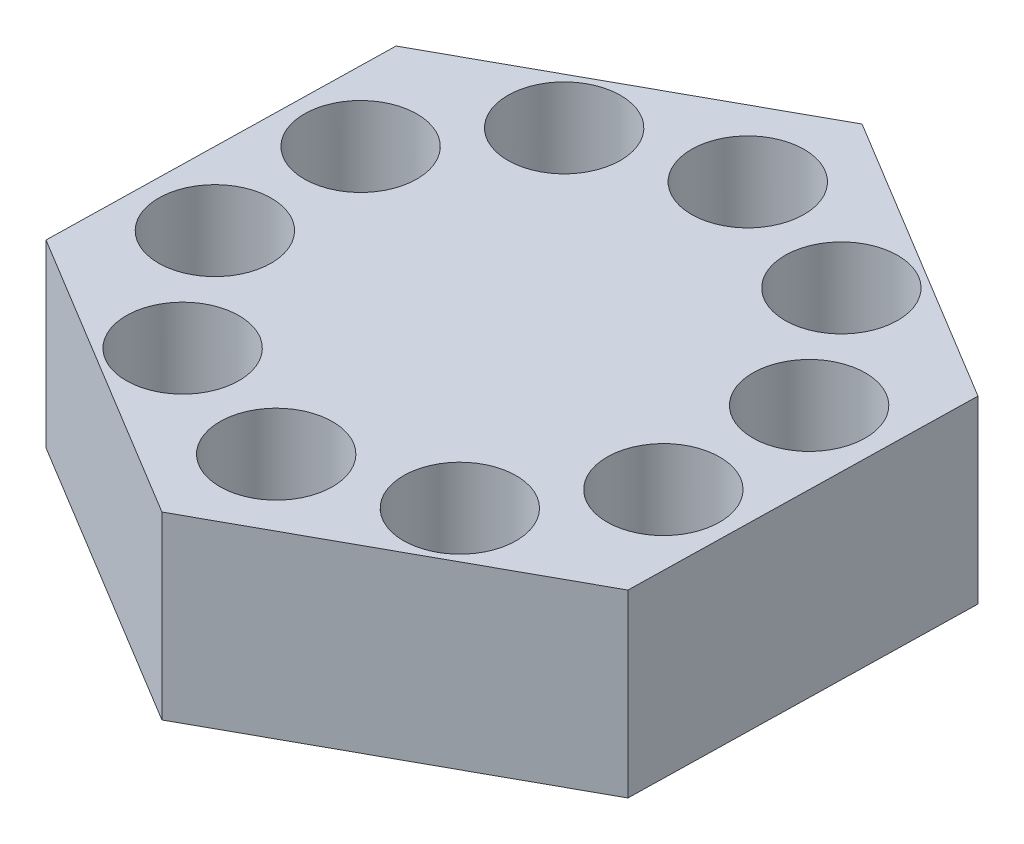
ISO-10303-21;
HEADER;
FILE_DESCRIPTION(('STEP AP214'),'2;1');
FILE_NAME('part.step','',(''),(''),'','','');
FILE_SCHEMA(('AUTOMOTIVE_DESIGN { 1 0 10303 214 1 1 1 1 }'));
ENDSEC;
DATA;
#1=APPLICATION_CONTEXT('core data for automotive mechanical design processes');
#2=APPLICATION_PROTOCOL_DEFINITION('international standard','automotive_design',2000,#1);
#3=PRODUCT_CONTEXT('',#1,'mechanical');
#4=PRODUCT('Part','Part','',(#3));
#5=PRODUCT_RELATED_PRODUCT_CATEGORY('part','',(#4));
#6=PRODUCT_DEFINITION_FORMATION('','',#4);
#7=PRODUCT_DEFINITION_CONTEXT('part definition',#1,'design');
#8=PRODUCT_DEFINITION('design','',#6,#7);
#9=PRODUCT_DEFINITION_SHAPE('','',#8);
#10=(LENGTH_UNIT() NAMED_UNIT(*) SI_UNIT(.MILLI.,.METRE.));
#11=(NAMED_UNIT(*) PLANE_ANGLE_UNIT() SI_UNIT($,.RADIAN.));
#12=(NAMED_UNIT(*) SI_UNIT($,.STERADIAN.) SOLID_ANGLE_UNIT());
#13=UNCERTAINTY_MEASURE_WITH_UNIT(LENGTH_MEASURE(1.E-05),#10,'distance_accuracy_value','');
#14=(GEOMETRIC_REPRESENTATION_CONTEXT(3) GLOBAL_UNCERTAINTY_ASSIGNED_CONTEXT((#13)) GLOBAL_UNIT_ASSIGNED_CONTEXT((#10,
#11,#12)) REPRESENTATION_CONTEXT('',''));
#15=CARTESIAN_POINT('',(0.,0.,0.));
#16=DIRECTION('',(0.,0.,1.));
#17=DIRECTION('',(1.,0.,0.));
#18=AXIS2_PLACEMENT_3D('',#15,#16,#17);
#19=CARTESIAN_POINT('',(-1.41267243604774,27.178,68.7033259763577));
#20=DIRECTION('',(-0.48209095163602,0.,-0.876121175609103));
#21=DIRECTION('',(-0.876121175609103,0.,0.48209095163602));
#22=AXIS2_PLACEMENT_3D('',#19,#20,#21);
#23=PLANE('',#22);
#24=DIRECTION('',(0.,-1.,0.));
#25=VECTOR('',#24,1.);
#26=CARTESIAN_POINT('',(-1.41267243604774,27.178,68.7033259763577));
#27=LINE('',#26,#25);
#28=CARTESIAN_POINT('',(-1.41267243604774,27.178,68.7033259763577));
#29=VERTEX_POINT('',#28);
#30=CARTESIAN_POINT('',(-1.41267243604774,-8.89,68.7033259763577));
#31=VERTEX_POINT('',#30);
#32=EDGE_CURVE('E103',#29,#31,#27,.T.);
#33=ORIENTED_EDGE('',*,*,#32,.T.);
#34=DIRECTION('',(0.876121175609103,0.,-0.48209095163602));
#35=VECTOR('',#34,1.);
#36=CARTESIAN_POINT('',(-1.41267243604774,-8.89,68.7033259763577));
#37=LINE('',#36,#35);
#38=CARTESIAN_POINT('',(58.7924894019852,-8.89,35.5750732050222));
#39=VERTEX_POINT('',#38);
#40=EDGE_CURVE('E97',#31,#39,#37,.T.);
#41=ORIENTED_EDGE('',*,*,#40,.T.);
#42=DIRECTION('',(0.,-1.,0.));
#43=VECTOR('',#42,1.);
#44=CARTESIAN_POINT('',(58.7924894019852,27.178,35.5750732050222));
#45=LINE('',#44,#43);
#46=CARTESIAN_POINT('',(58.7924894019852,27.178,35.5750732050222));
#47=VERTEX_POINT('',#46);
#48=EDGE_CURVE('E11',#47,#39,#45,.T.);
#49=ORIENTED_EDGE('',*,*,#48,.F.);
#50=DIRECTION('',(0.876121175609103,0.,-0.48209095163602));
#51=VECTOR('',#50,1.);
#52=CARTESIAN_POINT('',(-1.41267243604774,27.178,68.7033259763577));
#53=LINE('',#52,#51);
#54=EDGE_CURVE('E120',#29,#47,#53,.T.);
#55=ORIENTED_EDGE('',*,*,#54,.F.);
#56=EDGE_LOOP('',(#33,#41,#49,#55));
#57=FACE_BOUND('',#56,.T.);
#58=ADVANCED_FACE('F33',(#57),#23,.F.);
#59=CARTESIAN_POINT('',(58.7924894019852,27.178,35.5750732050222));
#60=DIRECTION('',(-0.99978867068898,0.,-0.0205575767531424));
#61=DIRECTION('',(-0.0205575767531424,0.,0.99978867068898));
#62=AXIS2_PLACEMENT_3D('',#59,#60,#61);
#63=PLANE('',#62);
#64=ORIENTED_EDGE('',*,*,#48,.T.);
#65=DIRECTION('',(0.0205575767531424,0.,-0.999788670688981));
#66=VECTOR('',#65,1.);
#67=CARTESIAN_POINT('',(58.7924894019852,-8.89,35.5750732050222));
#68=LINE('',#67,#66);
#69=CARTESIAN_POINT('',(60.2051618380329,-8.89,-33.1282527713354));
#70=VERTEX_POINT('',#69);
#71=EDGE_CURVE('E87',#39,#70,#68,.T.);
#72=ORIENTED_EDGE('',*,*,#71,.T.);
#73=DIRECTION('',(0.,-1.,0.));
#74=VECTOR('',#73,1.);
#75=CARTESIAN_POINT('',(60.2051618380329,27.178,-33.1282527713354));
#76=LINE('',#75,#74);
#77=CARTESIAN_POINT('',(60.2051618380329,27.178,-33.1282527713354));
#78=VERTEX_POINT('',#77);
#79=EDGE_CURVE('E40',#78,#70,#76,.T.);
#80=ORIENTED_EDGE('',*,*,#79,.F.);
#81=DIRECTION('',(0.0205575767531424,0.,-0.999788670688981));
#82=VECTOR('',#81,1.);
#83=CARTESIAN_POINT('',(58.7924894019852,27.178,35.5750732050222));
#84=LINE('',#83,#82);
#85=EDGE_CURVE('E88',#47,#78,#84,.T.);
#86=ORIENTED_EDGE('',*,*,#85,.F.);
#87=EDGE_LOOP('',(#64,#72,#80,#86));
#88=FACE_BOUND('',#87,.T.);
#89=ADVANCED_FACE('F85',(#88),#63,.F.);
#90=CARTESIAN_POINT('',(60.2051618380329,27.178,-33.1282527713354));
#91=DIRECTION('',(-0.51769771905296,0.,0.85556359885596));
#92=DIRECTION('',(0.85556359885596,0.,0.51769771905296));
#93=AXIS2_PLACEMENT_3D('',#90,#91,#92);
#94=PLANE('',#93);
#95=ORIENTED_EDGE('',*,*,#79,.T.);
#96=DIRECTION('',(-0.85556359885596,0.,-0.51769771905296));
#97=VECTOR('',#96,1.);
#98=CARTESIAN_POINT('',(60.2051618380329,-8.89,-33.1282527713354));
#99=LINE('',#98,#97);
#100=CARTESIAN_POINT('',(1.41267243604774,-8.89,-68.7033259763577));
#101=VERTEX_POINT('',#100);
#102=EDGE_CURVE('E101',#70,#101,#99,.T.);
#103=ORIENTED_EDGE('',*,*,#102,.T.);
#104=DIRECTION('',(0.,-1.,0.));
#105=VECTOR('',#104,1.);
#106=CARTESIAN_POINT('',(1.41267243604774,27.178,-68.7033259763577));
#107=LINE('',#106,#105);
#108=CARTESIAN_POINT('',(1.41267243604774,27.178,-68.7033259763577));
#109=VERTEX_POINT('',#108);
#110=EDGE_CURVE('E134',#109,#101,#107,.T.);
#111=ORIENTED_EDGE('',*,*,#110,.F.);
#112=DIRECTION('',(-0.85556359885596,0.,-0.51769771905296));
#113=VECTOR('',#112,1.);
#114=CARTESIAN_POINT('',(60.2051618380329,27.178,-33.1282527713354));
#115=LINE('',#114,#113);
#116=EDGE_CURVE('E123',#78,#109,#115,.T.);
#117=ORIENTED_EDGE('',*,*,#116,.F.);
#118=EDGE_LOOP('',(#95,#103,#111,#117));
#119=FACE_BOUND('',#118,.T.);
#120=ADVANCED_FACE('F137',(#119),#94,.F.);
#121=CARTESIAN_POINT('',(1.41267243604774,27.178,-68.7033259763577));
#122=DIRECTION('',(0.48209095163602,0.,0.876121175609103));
#123=DIRECTION('',(0.876121175609103,0.,-0.48209095163602));
#124=AXIS2_PLACEMENT_3D('',#121,#122,#123);
#125=PLANE('',#124);
#126=ORIENTED_EDGE('',*,*,#110,.T.);
#127=DIRECTION('',(-0.876121175609103,0.,0.48209095163602));
#128=VECTOR('',#127,1.);
#129=CARTESIAN_POINT('',(1.41267243604774,-8.89,-68.7033259763577));
#130=LINE('',#129,#128);
#131=CARTESIAN_POINT('',(-58.7924894019852,-8.89,-35.5750732050223));
#132=VERTEX_POINT('',#131);
#133=EDGE_CURVE('E112',#101,#132,#130,.T.);
#134=ORIENTED_EDGE('',*,*,#133,.T.);
#135=DIRECTION('',(0.,-1.,0.));
#136=VECTOR('',#135,1.);
#137=CARTESIAN_POINT('',(-58.7924894019852,27.178,-35.5750732050223));
#138=LINE('',#137,#136);
#139=CARTESIAN_POINT('',(-58.7924894019852,27.178,-35.5750732050223));
#140=VERTEX_POINT('',#139);
#141=EDGE_CURVE('E132',#140,#132,#138,.T.);
#142=ORIENTED_EDGE('',*,*,#141,.F.);
#143=DIRECTION('',(-0.876121175609103,0.,0.48209095163602));
#144=VECTOR('',#143,1.);
#145=CARTESIAN_POINT('',(1.41267243604774,27.178,-68.7033259763577));
#146=LINE('',#145,#144);
#147=EDGE_CURVE('E125',#109,#140,#146,.T.);
#148=ORIENTED_EDGE('',*,*,#147,.F.);
#149=EDGE_LOOP('',(#126,#134,#142,#148));
#150=FACE_BOUND('',#149,.T.);
#151=ADVANCED_FACE('F143',(#150),#125,.F.);
#152=CARTESIAN_POINT('',(-58.7924894019852,27.178,-35.5750732050223));
#153=DIRECTION('',(0.999788670688981,0.,0.0205575767531425));
#154=DIRECTION('',(0.0205575767531425,0.,-0.999788670688981));
#155=AXIS2_PLACEMENT_3D('',#152,#153,#154);
#156=PLANE('',#155);
#157=ORIENTED_EDGE('',*,*,#141,.T.);
#158=DIRECTION('',(-0.0205575767531425,0.,0.99978867068898));
#159=VECTOR('',#158,1.);
#160=CARTESIAN_POINT('',(-58.7924894019852,-8.89,-35.5750732050223));
#161=LINE('',#160,#159);
#162=CARTESIAN_POINT('',(-60.2051618380329,-8.89,33.1282527713354));
#163=VERTEX_POINT('',#162);
#164=EDGE_CURVE('E115',#132,#163,#161,.T.);
#165=ORIENTED_EDGE('',*,*,#164,.T.);
#166=DIRECTION('',(0.,-1.,0.));
#167=VECTOR('',#166,1.);
#168=CARTESIAN_POINT('',(-60.2051618380329,27.178,33.1282527713354));
#169=LINE('',#168,#167);
#170=CARTESIAN_POINT('',(-60.2051618380329,27.178,33.1282527713354));
#171=VERTEX_POINT('',#170);
#172=EDGE_CURVE('E130',#171,#163,#169,.T.);
#173=ORIENTED_EDGE('',*,*,#172,.F.);
#174=DIRECTION('',(-0.0205575767531425,0.,0.99978867068898));
#175=VECTOR('',#174,1.);
#176=CARTESIAN_POINT('',(-58.7924894019852,27.178,-35.5750732050223));
#177=LINE('',#176,#175);
#178=EDGE_CURVE('E52',#140,#171,#177,.T.);
#179=ORIENTED_EDGE('',*,*,#178,.F.);
#180=EDGE_LOOP('',(#157,#165,#173,#179));
#181=FACE_BOUND('',#180,.T.);
#182=ADVANCED_FACE('F146',(#181),#156,.F.);
#183=CARTESIAN_POINT('',(-60.2051618380329,27.178,33.1282527713354));
#184=DIRECTION('',(0.51769771905296,0.,-0.85556359885596));
#185=DIRECTION('',(-0.85556359885596,0.,-0.51769771905296));
#186=AXIS2_PLACEMENT_3D('',#183,#184,#185);
#187=PLANE('',#186);
#188=ORIENTED_EDGE('',*,*,#172,.T.);
#189=DIRECTION('',(0.85556359885596,0.,0.51769771905296));
#190=VECTOR('',#189,1.);
#191=CARTESIAN_POINT('',(-60.2051618380329,-8.89,33.1282527713354));
#192=LINE('',#191,#190);
#193=EDGE_CURVE('E118',#163,#31,#192,.T.);
#194=ORIENTED_EDGE('',*,*,#193,.T.);
#195=ORIENTED_EDGE('',*,*,#32,.F.);
#196=DIRECTION('',(0.85556359885596,0.,0.51769771905296));
#197=VECTOR('',#196,1.);
#198=CARTESIAN_POINT('',(-60.2051618380329,27.178,33.1282527713354));
#199=LINE('',#198,#197);
#200=EDGE_CURVE('E47',#171,#29,#199,.T.);
#201=ORIENTED_EDGE('',*,*,#200,.F.);
#202=EDGE_LOOP('',(#188,#194,#195,#201));
#203=FACE_BOUND('',#202,.T.);
#204=ADVANCED_FACE('F148',(#203),#187,.F.);
#205=CARTESIAN_POINT('',(0.,27.178,0.));
#206=DIRECTION('',(0.,1.,0.));
#207=DIRECTION('',(0.,0.,1.));
#208=AXIS2_PLACEMENT_3D('',#205,#206,#207);
#209=PLANE('',#208);
#210=CARTESIAN_POINT('',(27.7587286513236,27.178,38.206612250948));
#211=DIRECTION('',(0.,1.,0.));
#212=DIRECTION('',(0.587785252292462,0.,0.809016994374955));
#213=AXIS2_PLACEMENT_3D('',#210,#211,#212);
#214=CIRCLE('',#213,11.2894808694161);
#215=CARTESIAN_POINT('',(34.3945190124043,27.178,47.3399941319766));
#216=VERTEX_POINT('',#215);
#217=EDGE_CURVE('E302',#216,#216,#214,.T.);
#218=ORIENTED_EDGE('',*,*,#217,.F.);
#219=EDGE_LOOP('',(#218));
#220=FACE_BOUND('',#219,.T.);
#221=CARTESIAN_POINT('',(44.9145664423277,27.178,14.5936272848744));
#222=DIRECTION('',(0.,1.,0.));
#223=DIRECTION('',(0.95105651629515,0.,0.309016994374958));
#224=AXIS2_PLACEMENT_3D('',#221,#222,#223);
#225=CIRCLE('',#224,11.2894808694161);
#226=CARTESIAN_POINT('',(55.6515007887754,27.178,18.0822687311949));
#227=VERTEX_POINT('',#226);
#228=EDGE_CURVE('E306',#227,#227,#225,.T.);
#229=ORIENTED_EDGE('',*,*,#228,.F.);
#230=EDGE_LOOP('',(#229));
#231=FACE_BOUND('',#230,.T.);
#232=CARTESIAN_POINT('',(44.914566442328,27.178,-14.5936272848734));
#233=DIRECTION('',(0.,1.,0.));
#234=DIRECTION('',(0.951056516295157,0.,-0.309016994374938));
#235=AXIS2_PLACEMENT_3D('',#232,#233,#234);
#236=CIRCLE('',#235,11.2894808694161);
#237=CARTESIAN_POINT('',(55.6515007887757,27.178,-18.0822687311938));
#238=VERTEX_POINT('',#237);
#239=EDGE_CURVE('E363',#238,#238,#236,.T.);
#240=ORIENTED_EDGE('',*,*,#239,.F.);
#241=EDGE_LOOP('',(#240));
#242=FACE_BOUND('',#241,.T.);
#243=CARTESIAN_POINT('',(27.7587286513244,27.178,-38.2066122509474));
#244=DIRECTION('',(0.,1.,0.));
#245=DIRECTION('',(0.58778525229248,0.,-0.809016994374942));
#246=AXIS2_PLACEMENT_3D('',#243,#244,#245);
#247=CIRCLE('',#246,11.2894808694161);
#248=CARTESIAN_POINT('',(34.3945190124053,27.178,-47.3399941319758));
#249=VERTEX_POINT('',#248);
#250=EDGE_CURVE('E357',#249,#249,#247,.T.);
#251=ORIENTED_EDGE('',*,*,#250,.F.);
#252=EDGE_LOOP('',(#251));
#253=FACE_BOUND('',#252,.T.);
#254=CARTESIAN_POINT('',(0.,27.178,-47.2259699321475));
#255=DIRECTION('',(0.,1.,0.));
#256=DIRECTION('',(0.,0.,-1.));
#257=AXIS2_PLACEMENT_3D('',#254,#255,#256);
#258=CIRCLE('',#257,11.2894808694161);
#259=CARTESIAN_POINT('',(0.,27.178,-58.5154508015636));
#260=VERTEX_POINT('',#259);
#261=EDGE_CURVE('E351',#260,#260,#258,.T.);
#262=ORIENTED_EDGE('',*,*,#261,.F.);
#263=EDGE_LOOP('',(#262));
#264=FACE_BOUND('',#263,.T.);
#265=CARTESIAN_POINT('',(-27.7587286513238,27.178,-38.2066122509478));
#266=DIRECTION('',(0.,1.,0.));
#267=DIRECTION('',(-0.587785252292469,0.,-0.809016994374951));
#268=AXIS2_PLACEMENT_3D('',#265,#266,#267);
#269=CIRCLE('',#268,11.2894808694161);
#270=CARTESIAN_POINT('',(-34.3945190124046,27.178,-47.3399941319763));
#271=VERTEX_POINT('',#270);
#272=EDGE_CURVE('E345',#271,#271,#269,.T.);
#273=ORIENTED_EDGE('',*,*,#272,.F.);
#274=EDGE_LOOP('',(#273));
#275=FACE_BOUND('',#274,.T.);
#276=CARTESIAN_POINT('',(-44.9145664423278,27.178,-14.5936272848741));
#277=DIRECTION('',(0.,1.,0.));
#278=DIRECTION('',(-0.951056516295152,0.,-0.309016994374952));
#279=AXIS2_PLACEMENT_3D('',#276,#277,#278);
#280=CIRCLE('',#279,11.2894808694161);
#281=CARTESIAN_POINT('',(-55.6515007887755,27.178,-18.0822687311945));
#282=VERTEX_POINT('',#281);
#283=EDGE_CURVE('E339',#282,#282,#280,.T.);
#284=ORIENTED_EDGE('',*,*,#283,.F.);
#285=EDGE_LOOP('',(#284));
#286=FACE_BOUND('',#285,.T.);
#287=CARTESIAN_POINT('',(-44.9145664423279,27.178,14.5936272848737));
#288=DIRECTION('',(0.,1.,0.));
#289=DIRECTION('',(-0.951056516295155,0.,0.309016994374945));
#290=AXIS2_PLACEMENT_3D('',#287,#288,#289);
#291=CIRCLE('',#290,11.2894808694161);
#292=CARTESIAN_POINT('',(-55.6515007887756,27.178,18.0822687311941));
#293=VERTEX_POINT('',#292);
#294=EDGE_CURVE('E331',#293,#293,#291,.T.);
#295=ORIENTED_EDGE('',*,*,#294,.F.);
#296=EDGE_LOOP('',(#295));
#297=FACE_BOUND('',#296,.T.);
#298=CARTESIAN_POINT('',(-27.7587286513241,27.178,38.2066122509476));
#299=DIRECTION('',(0.,1.,0.));
#300=DIRECTION('',(-0.587785252292474,0.,0.809016994374947));
#301=AXIS2_PLACEMENT_3D('',#298,#299,#300);
#302=CIRCLE('',#301,11.2894808694161);
#303=CARTESIAN_POINT('',(-34.3945190124049,27.178,47.3399941319761));
#304=VERTEX_POINT('',#303);
#305=EDGE_CURVE('E314',#304,#304,#302,.T.);
#306=ORIENTED_EDGE('',*,*,#305,.F.);
#307=EDGE_LOOP('',(#306));
#308=FACE_BOUND('',#307,.T.);
#309=CARTESIAN_POINT('',(0.,27.178,47.2259699321475));
#310=DIRECTION('',(0.,1.,0.));
#311=DIRECTION('',(0.,0.,1.));
#312=AXIS2_PLACEMENT_3D('',#309,#310,#311);
#313=CIRCLE('',#312,11.2894808694161);
#314=CARTESIAN_POINT('',(0.,27.178,58.5154508015636));
#315=VERTEX_POINT('',#314);
#316=EDGE_CURVE('E107',#315,#315,#313,.T.);
#317=ORIENTED_EDGE('',*,*,#316,.F.);
#318=EDGE_LOOP('',(#317));
#319=FACE_BOUND('',#318,.T.);
#320=ORIENTED_EDGE('',*,*,#54,.T.);
#321=ORIENTED_EDGE('',*,*,#85,.T.);
#322=ORIENTED_EDGE('',*,*,#116,.T.);
#323=ORIENTED_EDGE('',*,*,#147,.T.);
#324=ORIENTED_EDGE('',*,*,#178,.T.);
#325=ORIENTED_EDGE('',*,*,#200,.T.);
#326=EDGE_LOOP('',(#320,#321,#322,#323,#324,#325));
#327=FACE_BOUND('',#326,.T.);
#328=ADVANCED_FACE('F140',(#220,#231,#242,#253,#264,#275,#286,#297,#308,#319,#327),#209,.T.);
#329=CARTESIAN_POINT('',(0.,-8.89,0.));
#330=DIRECTION('',(0.,1.,0.));
#331=DIRECTION('',(0.,0.,1.));
#332=AXIS2_PLACEMENT_3D('',#329,#330,#331);
#333=PLANE('',#332);
#334=CARTESIAN_POINT('',(27.7587286513236,-8.89,38.206612250948));
#335=DIRECTION('',(0.,1.,0.));
#336=DIRECTION('',(0.,0.,1.));
#337=AXIS2_PLACEMENT_3D('',#334,#335,#336);
#338=CIRCLE('',#337,11.2894808694161);
#339=CARTESIAN_POINT('',(27.7587286513236,-8.89,49.4960931203641));
#340=VERTEX_POINT('',#339);
#341=EDGE_CURVE('E305',#340,#340,#338,.F.);
#342=ORIENTED_EDGE('',*,*,#341,.F.);
#343=EDGE_LOOP('',(#342));
#344=FACE_BOUND('',#343,.T.);
#345=CARTESIAN_POINT('',(44.9145664423277,-8.89,14.5936272848744));
#346=DIRECTION('',(0.,1.,0.));
#347=DIRECTION('',(0.,0.,1.));
#348=AXIS2_PLACEMENT_3D('',#345,#346,#347);
#349=CIRCLE('',#348,11.2894808694161);
#350=CARTESIAN_POINT('',(44.9145664423277,-8.89,25.8831081542905));
#351=VERTEX_POINT('',#350);
#352=EDGE_CURVE('E309',#351,#351,#349,.F.);
#353=ORIENTED_EDGE('',*,*,#352,.F.);
#354=EDGE_LOOP('',(#353));
#355=FACE_BOUND('',#354,.T.);
#356=CARTESIAN_POINT('',(44.914566442328,-8.89,-14.5936272848734));
#357=DIRECTION('',(0.,1.,0.));
#358=DIRECTION('',(0.,0.,1.));
#359=AXIS2_PLACEMENT_3D('',#356,#357,#358);
#360=CIRCLE('',#359,11.2894808694161);
#361=CARTESIAN_POINT('',(44.914566442328,-8.89,-3.30414641545729));
#362=VERTEX_POINT('',#361);
#363=EDGE_CURVE('E360',#362,#362,#360,.F.);
#364=ORIENTED_EDGE('',*,*,#363,.F.);
#365=EDGE_LOOP('',(#364));
#366=FACE_BOUND('',#365,.T.);
#367=CARTESIAN_POINT('',(27.7587286513244,-8.89,-38.2066122509474));
#368=DIRECTION('',(0.,1.,0.));
#369=DIRECTION('',(0.,0.,1.));
#370=AXIS2_PLACEMENT_3D('',#367,#368,#369);
#371=CIRCLE('',#370,11.2894808694161);
#372=CARTESIAN_POINT('',(27.7587286513244,-8.89,-26.9171313815312));
#373=VERTEX_POINT('',#372);
#374=EDGE_CURVE('E354',#373,#373,#371,.F.);
#375=ORIENTED_EDGE('',*,*,#374,.F.);
#376=EDGE_LOOP('',(#375));
#377=FACE_BOUND('',#376,.T.);
#378=CARTESIAN_POINT('',(0.,-8.89,-47.2259699321475));
#379=DIRECTION('',(0.,1.,0.));
#380=DIRECTION('',(0.,0.,1.));
#381=AXIS2_PLACEMENT_3D('',#378,#379,#380);
#382=CIRCLE('',#381,11.2894808694161);
#383=CARTESIAN_POINT('',(0.,-8.89,-35.9364890627313));
#384=VERTEX_POINT('',#383);
#385=EDGE_CURVE('E348',#384,#384,#382,.F.);
#386=ORIENTED_EDGE('',*,*,#385,.F.);
#387=EDGE_LOOP('',(#386));
#388=FACE_BOUND('',#387,.T.);
#389=CARTESIAN_POINT('',(-27.7587286513238,-8.89,-38.2066122509478));
#390=DIRECTION('',(0.,1.,0.));
#391=DIRECTION('',(0.,0.,1.));
#392=AXIS2_PLACEMENT_3D('',#389,#390,#391);
#393=CIRCLE('',#392,11.2894808694161);
#394=CARTESIAN_POINT('',(-27.7587286513238,-8.89,-26.9171313815316));
#395=VERTEX_POINT('',#394);
#396=EDGE_CURVE('E342',#395,#395,#393,.F.);
#397=ORIENTED_EDGE('',*,*,#396,.F.);
#398=EDGE_LOOP('',(#397));
#399=FACE_BOUND('',#398,.T.);
#400=CARTESIAN_POINT('',(-44.9145664423278,-8.89,-14.5936272848741));
#401=DIRECTION('',(0.,1.,0.));
#402=DIRECTION('',(0.,0.,1.));
#403=AXIS2_PLACEMENT_3D('',#400,#401,#402);
#404=CIRCLE('',#403,11.2894808694161);
#405=CARTESIAN_POINT('',(-44.9145664423278,-8.89,-3.30414641545792));
#406=VERTEX_POINT('',#405);
#407=EDGE_CURVE('E336',#406,#406,#404,.F.);
#408=ORIENTED_EDGE('',*,*,#407,.F.);
#409=EDGE_LOOP('',(#408));
#410=FACE_BOUND('',#409,.T.);
#411=CARTESIAN_POINT('',(-44.9145664423279,-8.89,14.5936272848737));
#412=DIRECTION('',(0.,1.,0.));
#413=DIRECTION('',(0.,0.,1.));
#414=AXIS2_PLACEMENT_3D('',#411,#412,#413);
#415=CIRCLE('',#414,11.2894808694161);
#416=CARTESIAN_POINT('',(-44.9145664423279,-8.89,25.8831081542899));
#417=VERTEX_POINT('',#416);
#418=EDGE_CURVE('E318',#417,#417,#415,.F.);
#419=ORIENTED_EDGE('',*,*,#418,.F.);
#420=EDGE_LOOP('',(#419));
#421=FACE_BOUND('',#420,.T.);
#422=CARTESIAN_POINT('',(-27.7587286513241,-8.89,38.2066122509476));
#423=DIRECTION('',(0.,1.,0.));
#424=DIRECTION('',(0.,0.,1.));
#425=AXIS2_PLACEMENT_3D('',#422,#423,#424);
#426=CIRCLE('',#425,11.2894808694161);
#427=CARTESIAN_POINT('',(-27.7587286513241,-8.89,49.4960931203637));
#428=VERTEX_POINT('',#427);
#429=EDGE_CURVE('E317',#428,#428,#426,.F.);
#430=ORIENTED_EDGE('',*,*,#429,.F.);
#431=EDGE_LOOP('',(#430));
#432=FACE_BOUND('',#431,.T.);
#433=CARTESIAN_POINT('',(0.,-8.89,47.2259699321475));
#434=DIRECTION('',(0.,1.,0.));
#435=DIRECTION('',(0.,0.,1.));
#436=AXIS2_PLACEMENT_3D('',#433,#434,#435);
#437=CIRCLE('',#436,11.2894808694161);
#438=CARTESIAN_POINT('',(0.,-8.89,58.5154508015636));
#439=VERTEX_POINT('',#438);
#440=EDGE_CURVE('E104',#439,#439,#437,.F.);
#441=ORIENTED_EDGE('',*,*,#440,.F.);
#442=EDGE_LOOP('',(#441));
#443=FACE_BOUND('',#442,.T.);
#444=ORIENTED_EDGE('',*,*,#40,.F.);
#445=ORIENTED_EDGE('',*,*,#193,.F.);
#446=ORIENTED_EDGE('',*,*,#164,.F.);
#447=ORIENTED_EDGE('',*,*,#133,.F.);
#448=ORIENTED_EDGE('',*,*,#102,.F.);
#449=ORIENTED_EDGE('',*,*,#71,.F.);
#450=EDGE_LOOP('',(#444,#445,#446,#447,#448,#449));
#451=FACE_BOUND('',#450,.T.);
#452=ADVANCED_FACE('F95',(#344,#355,#366,#377,#388,#399,#410,#421,#432,#443,#451),#333,.F.);
#453=CARTESIAN_POINT('',(0.,-8.891,47.2259699321475));
#454=DIRECTION('',(0.,1.,0.));
#455=DIRECTION('',(0.,0.,1.));
#456=AXIS2_PLACEMENT_3D('',#453,#454,#455);
#457=CYLINDRICAL_SURFACE('',#456,11.2894808694161);
#458=ORIENTED_EDGE('',*,*,#316,.T.);
#459=EDGE_LOOP('',(#458));
#460=FACE_BOUND('',#459,.T.);
#461=ORIENTED_EDGE('',*,*,#440,.T.);
#462=EDGE_LOOP('',(#461));
#463=FACE_BOUND('',#462,.T.);
#464=ADVANCED_FACE('F186',(#460,#463),#457,.F.);
#465=CARTESIAN_POINT('',(-27.7587286513241,-8.891,38.2066122509476));
#466=DIRECTION('',(0.,1.,0.));
#467=DIRECTION('',(0.,0.,1.));
#468=AXIS2_PLACEMENT_3D('',#465,#466,#467);
#469=CYLINDRICAL_SURFACE('',#468,11.2894808694161);
#470=ORIENTED_EDGE('',*,*,#305,.T.);
#471=EDGE_LOOP('',(#470));
#472=FACE_BOUND('',#471,.T.);
#473=ORIENTED_EDGE('',*,*,#429,.T.);
#474=EDGE_LOOP('',(#473));
#475=FACE_BOUND('',#474,.T.);
#476=ADVANCED_FACE('F191',(#472,#475),#469,.F.);
#477=CARTESIAN_POINT('',(-44.9145664423279,-8.891,14.5936272848737));
#478=DIRECTION('',(0.,1.,0.));
#479=DIRECTION('',(0.,0.,1.));
#480=AXIS2_PLACEMENT_3D('',#477,#478,#479);
#481=CYLINDRICAL_SURFACE('',#480,11.2894808694161);
#482=ORIENTED_EDGE('',*,*,#294,.T.);
#483=EDGE_LOOP('',(#482));
#484=FACE_BOUND('',#483,.T.);
#485=ORIENTED_EDGE('',*,*,#418,.T.);
#486=EDGE_LOOP('',(#485));
#487=FACE_BOUND('',#486,.T.);
#488=ADVANCED_FACE('F215',(#484,#487),#481,.F.);
#489=CARTESIAN_POINT('',(-44.9145664423278,-8.891,-14.5936272848741));
#490=DIRECTION('',(0.,1.,0.));
#491=DIRECTION('',(0.,0.,1.));
#492=AXIS2_PLACEMENT_3D('',#489,#490,#491);
#493=CYLINDRICAL_SURFACE('',#492,11.2894808694161);
#494=ORIENTED_EDGE('',*,*,#283,.T.);
#495=EDGE_LOOP('',(#494));
#496=FACE_BOUND('',#495,.T.);
#497=ORIENTED_EDGE('',*,*,#407,.T.);
#498=EDGE_LOOP('',(#497));
#499=FACE_BOUND('',#498,.T.);
#500=ADVANCED_FACE('F225',(#496,#499),#493,.F.);
#501=CARTESIAN_POINT('',(-27.7587286513238,-8.891,-38.2066122509478));
#502=DIRECTION('',(0.,1.,0.));
#503=DIRECTION('',(0.,0.,1.));
#504=AXIS2_PLACEMENT_3D('',#501,#502,#503);
#505=CYLINDRICAL_SURFACE('',#504,11.2894808694161);
#506=ORIENTED_EDGE('',*,*,#272,.T.);
#507=EDGE_LOOP('',(#506));
#508=FACE_BOUND('',#507,.T.);
#509=ORIENTED_EDGE('',*,*,#396,.T.);
#510=EDGE_LOOP('',(#509));
#511=FACE_BOUND('',#510,.T.);
#512=ADVANCED_FACE('F235',(#508,#511),#505,.F.);
#513=CARTESIAN_POINT('',(0.,-8.891,-47.2259699321475));
#514=DIRECTION('',(0.,1.,0.));
#515=DIRECTION('',(0.,0.,1.));
#516=AXIS2_PLACEMENT_3D('',#513,#514,#515);
#517=CYLINDRICAL_SURFACE('',#516,11.2894808694161);
#518=ORIENTED_EDGE('',*,*,#261,.T.);
#519=EDGE_LOOP('',(#518));
#520=FACE_BOUND('',#519,.T.);
#521=ORIENTED_EDGE('',*,*,#385,.T.);
#522=EDGE_LOOP('',(#521));
#523=FACE_BOUND('',#522,.T.);
#524=ADVANCED_FACE('F245',(#520,#523),#517,.F.);
#525=CARTESIAN_POINT('',(27.7587286513244,-8.891,-38.2066122509474));
#526=DIRECTION('',(0.,1.,0.));
#527=DIRECTION('',(0.,0.,1.));
#528=AXIS2_PLACEMENT_3D('',#525,#526,#527);
#529=CYLINDRICAL_SURFACE('',#528,11.2894808694161);
#530=ORIENTED_EDGE('',*,*,#250,.T.);
#531=EDGE_LOOP('',(#530));
#532=FACE_BOUND('',#531,.T.);
#533=ORIENTED_EDGE('',*,*,#374,.T.);
#534=EDGE_LOOP('',(#533));
#535=FACE_BOUND('',#534,.T.);
#536=ADVANCED_FACE('F255',(#532,#535),#529,.F.);
#537=CARTESIAN_POINT('',(44.914566442328,-8.891,-14.5936272848734));
#538=DIRECTION('',(0.,1.,0.));
#539=DIRECTION('',(0.,0.,1.));
#540=AXIS2_PLACEMENT_3D('',#537,#538,#539);
#541=CYLINDRICAL_SURFACE('',#540,11.2894808694161);
#542=ORIENTED_EDGE('',*,*,#239,.T.);
#543=EDGE_LOOP('',(#542));
#544=FACE_BOUND('',#543,.T.);
#545=ORIENTED_EDGE('',*,*,#363,.T.);
#546=EDGE_LOOP('',(#545));
#547=FACE_BOUND('',#546,.T.);
#548=ADVANCED_FACE('F265',(#544,#547),#541,.F.);
#549=CARTESIAN_POINT('',(44.9145664423277,-8.891,14.5936272848744));
#550=DIRECTION('',(0.,1.,0.));
#551=DIRECTION('',(0.,0.,1.));
#552=AXIS2_PLACEMENT_3D('',#549,#550,#551);
#553=CYLINDRICAL_SURFACE('',#552,11.2894808694161);
#554=ORIENTED_EDGE('',*,*,#228,.T.);
#555=EDGE_LOOP('',(#554));
#556=FACE_BOUND('',#555,.T.);
#557=ORIENTED_EDGE('',*,*,#352,.T.);
#558=EDGE_LOOP('',(#557));
#559=FACE_BOUND('',#558,.T.);
#560=ADVANCED_FACE('F275',(#556,#559),#553,.F.);
#561=CARTESIAN_POINT('',(27.7587286513236,-8.891,38.206612250948));
#562=DIRECTION('',(0.,1.,0.));
#563=DIRECTION('',(0.,0.,1.));
#564=AXIS2_PLACEMENT_3D('',#561,#562,#563);
#565=CYLINDRICAL_SURFACE('',#564,11.2894808694161);
#566=ORIENTED_EDGE('',*,*,#217,.T.);
#567=EDGE_LOOP('',(#566));
#568=FACE_BOUND('',#567,.T.);
#569=ORIENTED_EDGE('',*,*,#341,.T.);
#570=EDGE_LOOP('',(#569));
#571=FACE_BOUND('',#570,.T.);
#572=ADVANCED_FACE('F285',(#568,#571),#565,.F.);
#573=CLOSED_SHELL('',(#58,#89,#120,#151,#182,#204,#328,#452,#464,#476,#488,#500,#512,#524,#536,
#548,#560,#572));
#574=MANIFOLD_SOLID_BREP('B2',#573);
#575=ADVANCED_BREP_SHAPE_REPRESENTATION('',(#18,#574),#14);
#576=SHAPE_DEFINITION_REPRESENTATION(#9,#575);
ENDSEC;
END-ISO-10303-21;
